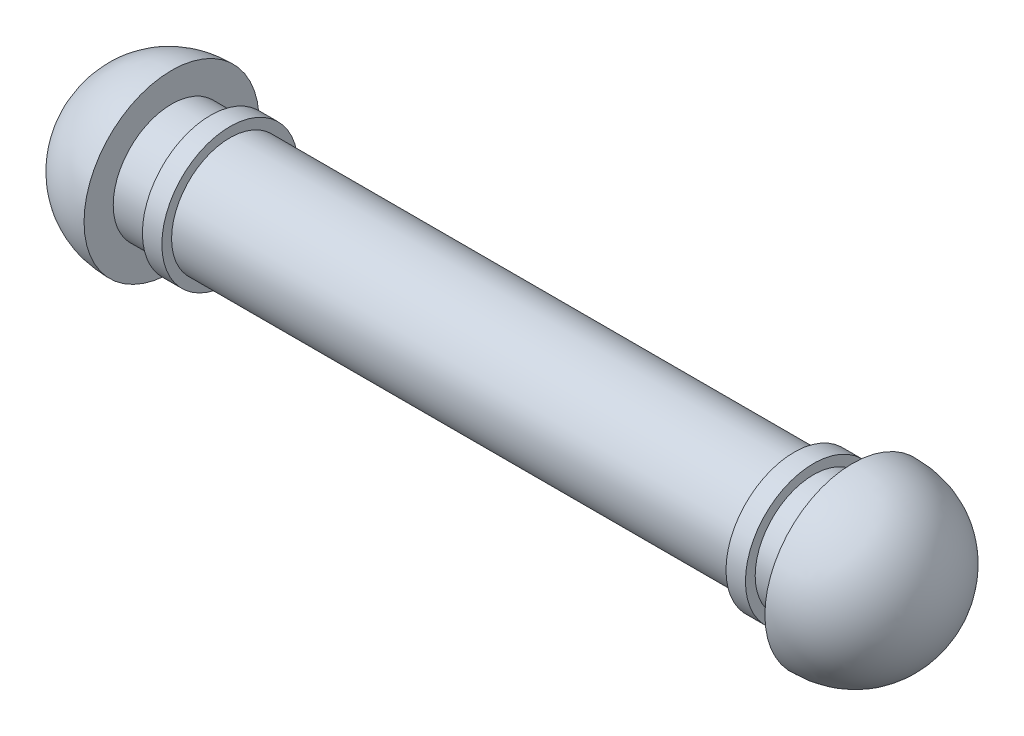
ISO-10303-21;
HEADER;
FILE_DESCRIPTION(('STEP AP214'),'2;1');
FILE_NAME('part.step','',(''),(''),'','','');
FILE_SCHEMA(('AUTOMOTIVE_DESIGN { 1 0 10303 214 1 1 1 1 }'));
ENDSEC;
DATA;
#1=APPLICATION_CONTEXT('core data for automotive mechanical design processes');
#2=APPLICATION_PROTOCOL_DEFINITION('international standard','automotive_design',2000,#1);
#3=PRODUCT_CONTEXT('',#1,'mechanical');
#4=PRODUCT('Part','Part','',(#3));
#5=PRODUCT_RELATED_PRODUCT_CATEGORY('part','',(#4));
#6=PRODUCT_DEFINITION_FORMATION('','',#4);
#7=PRODUCT_DEFINITION_CONTEXT('part definition',#1,'design');
#8=PRODUCT_DEFINITION('design','',#6,#7);
#9=PRODUCT_DEFINITION_SHAPE('','',#8);
#10=(LENGTH_UNIT() NAMED_UNIT(*) SI_UNIT(.MILLI.,.METRE.));
#11=(NAMED_UNIT(*) PLANE_ANGLE_UNIT() SI_UNIT($,.RADIAN.));
#12=(NAMED_UNIT(*) SI_UNIT($,.STERADIAN.) SOLID_ANGLE_UNIT());
#13=UNCERTAINTY_MEASURE_WITH_UNIT(LENGTH_MEASURE(1.E-05),#10,'distance_accuracy_value','');
#14=(GEOMETRIC_REPRESENTATION_CONTEXT(3) GLOBAL_UNCERTAINTY_ASSIGNED_CONTEXT((#13)) GLOBAL_UNIT_ASSIGNED_CONTEXT((#10,
#11,#12)) REPRESENTATION_CONTEXT('',''));
#15=CARTESIAN_POINT('',(0.,0.,0.));
#16=DIRECTION('',(0.,0.,1.));
#17=DIRECTION('',(1.,0.,0.));
#18=AXIS2_PLACEMENT_3D('',#15,#16,#17);
#19=CARTESIAN_POINT('',(175.,0.,0.));
#20=DIRECTION('',(-1.,0.,0.));
#21=DIRECTION('',(0.,0.,1.));
#22=AXIS2_PLACEMENT_3D('',#19,#20,#21);
#23=CYLINDRICAL_SURFACE('',#22,30.);
#24=CARTESIAN_POINT('',(30.,0.,0.));
#25=DIRECTION('',(-1.,0.,0.));
#26=DIRECTION('',(0.,0.,1.));
#27=AXIS2_PLACEMENT_3D('',#24,#25,#26);
#28=CIRCLE('',#27,30.);
#29=CARTESIAN_POINT('',(30.,0.,30.));
#30=VERTEX_POINT('',#29);
#31=EDGE_CURVE('E243',#30,#30,#28,.T.);
#32=ORIENTED_EDGE('',*,*,#31,.F.);
#33=EDGE_LOOP('',(#32));
#34=FACE_BOUND('',#33,.T.);
#35=CARTESIAN_POINT('',(320.,0.,0.));
#36=DIRECTION('',(1.,0.,0.));
#37=DIRECTION('',(0.,0.,-1.));
#38=AXIS2_PLACEMENT_3D('',#35,#36,#37);
#39=CIRCLE('',#38,30.);
#40=CARTESIAN_POINT('',(320.,0.,-30.));
#41=VERTEX_POINT('',#40);
#42=EDGE_CURVE('E50',#41,#41,#39,.T.);
#43=ORIENTED_EDGE('',*,*,#42,.F.);
#44=EDGE_LOOP('',(#43));
#45=FACE_BOUND('',#44,.T.);
#46=ADVANCED_FACE('F41',(#34,#45),#23,.T.);
#47=CARTESIAN_POINT('',(0.,0.,0.));
#48=DIRECTION('',(-1.,0.,0.));
#49=DIRECTION('',(0.,0.,1.));
#50=AXIS2_PLACEMENT_3D('',#47,#48,#49);
#51=CIRCLE('',#50,30.);
#52=CARTESIAN_POINT('',(0.,0.,30.));
#53=VERTEX_POINT('',#52);
#54=EDGE_CURVE('E228',#53,#53,#51,.T.);
#55=ORIENTED_EDGE('',*,*,#54,.F.);
#56=EDGE_LOOP('',(#55));
#57=FACE_BOUND('',#56,.T.);
#58=CARTESIAN_POINT('',(20.,0.,0.));
#59=DIRECTION('',(1.,0.,0.));
#60=DIRECTION('',(0.,0.,-1.));
#61=AXIS2_PLACEMENT_3D('',#58,#59,#60);
#62=CIRCLE('',#61,30.);
#63=CARTESIAN_POINT('',(20.,0.,-30.));
#64=VERTEX_POINT('',#63);
#65=EDGE_CURVE('E247',#64,#64,#62,.T.);
#66=ORIENTED_EDGE('',*,*,#65,.F.);
#67=EDGE_LOOP('',(#66));
#68=FACE_BOUND('',#67,.T.);
#69=ADVANCED_FACE('F43',(#57,#68),#23,.T.);
#70=CARTESIAN_POINT('',(20.,0.,0.));
#71=DIRECTION('',(1.,0.,0.));
#72=DIRECTION('',(0.,0.,-1.));
#73=AXIS2_PLACEMENT_3D('',#70,#71,#72);
#74=PLANE('',#73);
#75=ORIENTED_EDGE('',*,*,#65,.T.);
#76=EDGE_LOOP('',(#75));
#77=FACE_BOUND('',#76,.T.);
#78=CARTESIAN_POINT('',(20.,0.,0.));
#79=DIRECTION('',(-1.,0.,0.));
#80=DIRECTION('',(0.,0.,1.));
#81=AXIS2_PLACEMENT_3D('',#78,#79,#80);
#82=CIRCLE('',#81,35.);
#83=CARTESIAN_POINT('',(20.,0.,35.));
#84=VERTEX_POINT('',#83);
#85=EDGE_CURVE('E237',#84,#84,#82,.T.);
#86=ORIENTED_EDGE('',*,*,#85,.T.);
#87=EDGE_LOOP('',(#86));
#88=FACE_BOUND('',#87,.T.);
#89=ADVANCED_FACE('F107',(#77,#88),#74,.F.);
#90=CARTESIAN_POINT('',(-100.078673333577,0.,0.));
#91=DIRECTION('',(-1.,0.,0.));
#92=DIRECTION('',(0.,0.,1.));
#93=AXIS2_PLACEMENT_3D('',#90,#91,#92);
#94=CYLINDRICAL_SURFACE('',#93,35.);
#95=ORIENTED_EDGE('',*,*,#85,.F.);
#96=EDGE_LOOP('',(#95));
#97=FACE_BOUND('',#96,.T.);
#98=CARTESIAN_POINT('',(30.,0.,0.));
#99=DIRECTION('',(-1.,0.,0.));
#100=DIRECTION('',(0.,0.,1.));
#101=AXIS2_PLACEMENT_3D('',#98,#99,#100);
#102=CIRCLE('',#101,35.);
#103=CARTESIAN_POINT('',(30.,0.,35.));
#104=VERTEX_POINT('',#103);
#105=EDGE_CURVE('E234',#104,#104,#102,.T.);
#106=ORIENTED_EDGE('',*,*,#105,.T.);
#107=EDGE_LOOP('',(#106));
#108=FACE_BOUND('',#107,.T.);
#109=ADVANCED_FACE('F104',(#97,#108),#94,.T.);
#110=CARTESIAN_POINT('',(30.,35.,0.));
#111=DIRECTION('',(-1.,0.,0.));
#112=DIRECTION('',(0.,0.,1.));
#113=AXIS2_PLACEMENT_3D('',#110,#111,#112);
#114=PLANE('',#113);
#115=ORIENTED_EDGE('',*,*,#31,.T.);
#116=EDGE_LOOP('',(#115));
#117=FACE_BOUND('',#116,.T.);
#118=ORIENTED_EDGE('',*,*,#105,.F.);
#119=EDGE_LOOP('',(#118));
#120=FACE_BOUND('',#119,.T.);
#121=ADVANCED_FACE('F100',(#117,#120),#114,.F.);
#122=CARTESIAN_POINT('',(0.,45.,0.));
#123=CARTESIAN_POINT('',(-30.9912388312532,45.,0.));
#124=CARTESIAN_POINT('',(-45.4583925127281,20.1837818553006,0.));
#125=CARTESIAN_POINT('',(-45.4583925127281,0.,0.));
#126=B_SPLINE_CURVE_WITH_KNOTS('',3,(#122,#123,#124,#125),.UNSPECIFIED.,.F.,.F.,(4,4),(0.,1.),.UNSPECIFIED.);
#127=CARTESIAN_POINT('',(-100.078673333577,0.,0.));
#128=DIRECTION('',(-1.,0.,0.));
#129=AXIS1_PLACEMENT('',#127,#128);
#130=SURFACE_OF_REVOLUTION('',#126,#129);
#131=CARTESIAN_POINT('',(-45.4583925127281,0.,0.));
#132=VERTEX_POINT('',#131);
#133=VERTEX_LOOP('',#132);
#134=FACE_BOUND('',#133,.T.);
#135=CARTESIAN_POINT('',(0.,0.,0.));
#136=DIRECTION('',(-1.,0.,0.));
#137=DIRECTION('',(0.,0.,1.));
#138=AXIS2_PLACEMENT_3D('',#135,#136,#137);
#139=CIRCLE('',#138,45.);
#140=CARTESIAN_POINT('',(0.,0.,45.));
#141=VERTEX_POINT('',#140);
#142=EDGE_CURVE('E85',#141,#141,#139,.T.);
#143=ORIENTED_EDGE('',*,*,#142,.T.);
#144=EDGE_LOOP('',(#143));
#145=FACE_BOUND('',#144,.T.);
#146=ADVANCED_FACE('F95',(#134,#145),#130,.T.);
#147=CARTESIAN_POINT('',(0.,45.,0.));
#148=DIRECTION('',(-1.,0.,0.));
#149=DIRECTION('',(0.,0.,1.));
#150=AXIS2_PLACEMENT_3D('',#147,#148,#149);
#151=PLANE('',#150);
#152=ORIENTED_EDGE('',*,*,#54,.T.);
#153=EDGE_LOOP('',(#152));
#154=FACE_BOUND('',#153,.T.);
#155=ORIENTED_EDGE('',*,*,#142,.F.);
#156=EDGE_LOOP('',(#155));
#157=FACE_BOUND('',#156,.T.);
#158=ADVANCED_FACE('F99',(#154,#157),#151,.F.);
#159=CARTESIAN_POINT('',(330.,0.,0.));
#160=DIRECTION('',(-1.,0.,0.));
#161=DIRECTION('',(0.,0.,-1.));
#162=AXIS2_PLACEMENT_3D('',#159,#160,#161);
#163=PLANE('',#162);
#164=CARTESIAN_POINT('',(330.,0.,0.));
#165=DIRECTION('',(-1.,0.,0.));
#166=DIRECTION('',(0.,0.,1.));
#167=AXIS2_PLACEMENT_3D('',#164,#165,#166);
#168=CIRCLE('',#167,30.);
#169=CARTESIAN_POINT('',(330.,0.,30.));
#170=VERTEX_POINT('',#169);
#171=EDGE_CURVE('E11',#170,#170,#168,.T.);
#172=ORIENTED_EDGE('',*,*,#171,.T.);
#173=EDGE_LOOP('',(#172));
#174=FACE_BOUND('',#173,.T.);
#175=CARTESIAN_POINT('',(330.,0.,0.));
#176=DIRECTION('',(-1.,0.,0.));
#177=DIRECTION('',(0.,0.,1.));
#178=AXIS2_PLACEMENT_3D('',#175,#176,#177);
#179=CIRCLE('',#178,35.);
#180=CARTESIAN_POINT('',(330.,0.,35.));
#181=VERTEX_POINT('',#180);
#182=EDGE_CURVE('E71',#181,#181,#179,.T.);
#183=ORIENTED_EDGE('',*,*,#182,.F.);
#184=EDGE_LOOP('',(#183));
#185=FACE_BOUND('',#184,.T.);
#186=ADVANCED_FACE('F136',(#174,#185),#163,.F.);
#187=CARTESIAN_POINT('',(450.078673333577,0.,0.));
#188=DIRECTION('',(1.,0.,0.));
#189=DIRECTION('',(0.,0.,1.));
#190=AXIS2_PLACEMENT_3D('',#187,#188,#189);
#191=CYLINDRICAL_SURFACE('',#190,35.);
#192=ORIENTED_EDGE('',*,*,#182,.T.);
#193=EDGE_LOOP('',(#192));
#194=FACE_BOUND('',#193,.T.);
#195=CARTESIAN_POINT('',(320.,0.,0.));
#196=DIRECTION('',(-1.,0.,0.));
#197=DIRECTION('',(0.,0.,1.));
#198=AXIS2_PLACEMENT_3D('',#195,#196,#197);
#199=CIRCLE('',#198,35.);
#200=CARTESIAN_POINT('',(320.,0.,35.));
#201=VERTEX_POINT('',#200);
#202=EDGE_CURVE('E67',#201,#201,#199,.T.);
#203=ORIENTED_EDGE('',*,*,#202,.F.);
#204=EDGE_LOOP('',(#203));
#205=FACE_BOUND('',#204,.T.);
#206=ADVANCED_FACE('F129',(#194,#205),#191,.T.);
#207=CARTESIAN_POINT('',(320.,35.,0.));
#208=DIRECTION('',(1.,0.,0.));
#209=DIRECTION('',(0.,0.,1.));
#210=AXIS2_PLACEMENT_3D('',#207,#208,#209);
#211=PLANE('',#210);
#212=ORIENTED_EDGE('',*,*,#42,.T.);
#213=EDGE_LOOP('',(#212));
#214=FACE_BOUND('',#213,.T.);
#215=ORIENTED_EDGE('',*,*,#202,.T.);
#216=EDGE_LOOP('',(#215));
#217=FACE_BOUND('',#216,.T.);
#218=ADVANCED_FACE('F124',(#214,#217),#211,.F.);
#219=CARTESIAN_POINT('',(350.,0.,0.));
#220=DIRECTION('',(1.,0.,0.));
#221=DIRECTION('',(0.,0.,-1.));
#222=AXIS2_PLACEMENT_3D('',#219,#220,#221);
#223=CIRCLE('',#222,30.);
#224=CARTESIAN_POINT('',(350.,0.,-30.));
#225=VERTEX_POINT('',#224);
#226=EDGE_CURVE('E81',#225,#225,#223,.T.);
#227=ORIENTED_EDGE('',*,*,#226,.F.);
#228=EDGE_LOOP('',(#227));
#229=FACE_BOUND('',#228,.T.);
#230=ORIENTED_EDGE('',*,*,#171,.F.);
#231=EDGE_LOOP('',(#230));
#232=FACE_BOUND('',#231,.T.);
#233=ADVANCED_FACE('F60',(#229,#232),#23,.T.);
#234=CARTESIAN_POINT('',(350.,45.,0.));
#235=CARTESIAN_POINT('',(380.991238831253,45.,0.));
#236=CARTESIAN_POINT('',(395.458392512728,20.1837818553006,0.));
#237=CARTESIAN_POINT('',(395.458392512728,0.,0.));
#238=B_SPLINE_CURVE_WITH_KNOTS('',3,(#234,#235,#236,#237),.UNSPECIFIED.,.F.,.F.,(4,4),(0.,1.),.UNSPECIFIED.);
#239=CARTESIAN_POINT('',(450.078673333577,0.,0.));
#240=DIRECTION('',(1.,0.,0.));
#241=AXIS1_PLACEMENT('',#239,#240);
#242=SURFACE_OF_REVOLUTION('',#238,#241);
#243=CARTESIAN_POINT('',(395.458392512728,0.,0.));
#244=VERTEX_POINT('',#243);
#245=VERTEX_LOOP('',#244);
#246=FACE_BOUND('',#245,.T.);
#247=CARTESIAN_POINT('',(350.,0.,0.));
#248=DIRECTION('',(-1.,0.,0.));
#249=DIRECTION('',(0.,0.,1.));
#250=AXIS2_PLACEMENT_3D('',#247,#248,#249);
#251=CIRCLE('',#250,45.);
#252=CARTESIAN_POINT('',(350.,0.,45.));
#253=VERTEX_POINT('',#252);
#254=EDGE_CURVE('E64',#253,#253,#251,.T.);
#255=ORIENTED_EDGE('',*,*,#254,.F.);
#256=EDGE_LOOP('',(#255));
#257=FACE_BOUND('',#256,.T.);
#258=ADVANCED_FACE('F56',(#246,#257),#242,.T.);
#259=CARTESIAN_POINT('',(350.,45.,0.));
#260=DIRECTION('',(1.,0.,0.));
#261=DIRECTION('',(0.,0.,1.));
#262=AXIS2_PLACEMENT_3D('',#259,#260,#261);
#263=PLANE('',#262);
#264=ORIENTED_EDGE('',*,*,#226,.T.);
#265=EDGE_LOOP('',(#264));
#266=FACE_BOUND('',#265,.T.);
#267=ORIENTED_EDGE('',*,*,#254,.T.);
#268=EDGE_LOOP('',(#267));
#269=FACE_BOUND('',#268,.T.);
#270=ADVANCED_FACE('F59',(#266,#269),#263,.F.);
#271=CLOSED_SHELL('',(#46,#69,#89,#109,#121,#146,#158,#186,#206,#218,#233,#258,#270));
#272=MANIFOLD_SOLID_BREP('B2',#271);
#273=ADVANCED_BREP_SHAPE_REPRESENTATION('',(#18,#272),#14);
#274=SHAPE_DEFINITION_REPRESENTATION(#9,#273);
ENDSEC;
END-ISO-10303-21;
